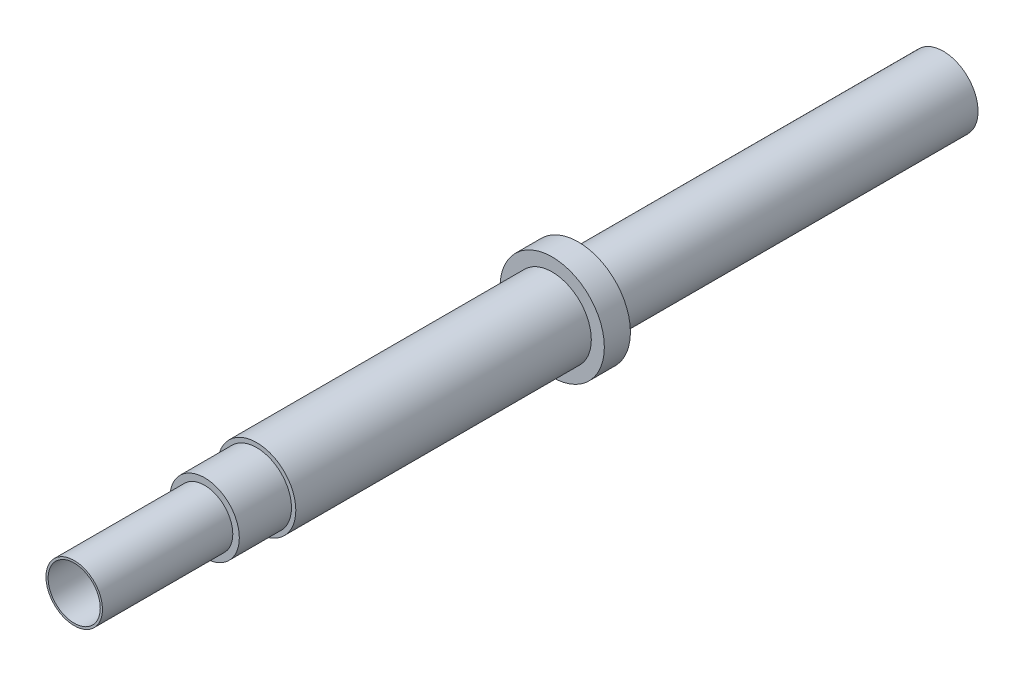
ISO-10303-21;
HEADER;
FILE_DESCRIPTION(('STEP AP214'),'2;1');
FILE_NAME('part.step','',(''),(''),'','','');
FILE_SCHEMA(('AUTOMOTIVE_DESIGN { 1 0 10303 214 1 1 1 1 }'));
ENDSEC;
DATA;
#1=APPLICATION_CONTEXT('core data for automotive mechanical design processes');
#2=APPLICATION_PROTOCOL_DEFINITION('international standard','automotive_design',2000,#1);
#3=PRODUCT_CONTEXT('',#1,'mechanical');
#4=PRODUCT('Part','Part','',(#3));
#5=PRODUCT_RELATED_PRODUCT_CATEGORY('part','',(#4));
#6=PRODUCT_DEFINITION_FORMATION('','',#4);
#7=PRODUCT_DEFINITION_CONTEXT('part definition',#1,'design');
#8=PRODUCT_DEFINITION('design','',#6,#7);
#9=PRODUCT_DEFINITION_SHAPE('','',#8);
#10=(LENGTH_UNIT() NAMED_UNIT(*) SI_UNIT(.MILLI.,.METRE.));
#11=(NAMED_UNIT(*) PLANE_ANGLE_UNIT() SI_UNIT($,.RADIAN.));
#12=(NAMED_UNIT(*) SI_UNIT($,.STERADIAN.) SOLID_ANGLE_UNIT());
#13=UNCERTAINTY_MEASURE_WITH_UNIT(LENGTH_MEASURE(1.E-05),#10,'distance_accuracy_value','');
#14=(GEOMETRIC_REPRESENTATION_CONTEXT(3) GLOBAL_UNCERTAINTY_ASSIGNED_CONTEXT((#13)) GLOBAL_UNIT_ASSIGNED_CONTEXT((#10,
#11,#12)) REPRESENTATION_CONTEXT('',''));
#15=CARTESIAN_POINT('',(0.,0.,0.));
#16=DIRECTION('',(0.,0.,1.));
#17=DIRECTION('',(1.,0.,0.));
#18=AXIS2_PLACEMENT_3D('',#15,#16,#17);
#19=CARTESIAN_POINT('',(0.,0.,85.));
#20=DIRECTION('',(0.,0.,1.));
#21=DIRECTION('',(1.,0.,0.));
#22=AXIS2_PLACEMENT_3D('',#19,#20,#21);
#23=PLANE('',#22);
#24=CARTESIAN_POINT('',(0.,0.,85.));
#25=DIRECTION('',(0.,0.,1.));
#26=DIRECTION('',(1.,0.,0.));
#27=AXIS2_PLACEMENT_3D('',#24,#25,#26);
#28=CIRCLE('',#27,4.);
#29=CARTESIAN_POINT('',(4.,0.,85.));
#30=VERTEX_POINT('',#29);
#31=EDGE_CURVE('E11',#30,#30,#28,.T.);
#32=ORIENTED_EDGE('',*,*,#31,.T.);
#33=EDGE_LOOP('',(#32));
#34=FACE_BOUND('',#33,.T.);
#35=CARTESIAN_POINT('',(0.,0.,85.));
#36=DIRECTION('',(0.,0.,1.));
#37=DIRECTION('',(1.,0.,0.));
#38=AXIS2_PLACEMENT_3D('',#35,#36,#37);
#39=CIRCLE('',#38,3.25);
#40=CARTESIAN_POINT('',(3.25,0.,85.));
#41=VERTEX_POINT('',#40);
#42=EDGE_CURVE('E62',#41,#41,#39,.T.);
#43=ORIENTED_EDGE('',*,*,#42,.F.);
#44=EDGE_LOOP('',(#43));
#45=FACE_BOUND('',#44,.T.);
#46=ADVANCED_FACE('F46',(#34,#45),#23,.T.);
#47=CARTESIAN_POINT('',(0.,0.,79.));
#48=DIRECTION('',(0.,0.,1.));
#49=DIRECTION('',(1.,0.,0.));
#50=AXIS2_PLACEMENT_3D('',#47,#48,#49);
#51=PLANE('',#50);
#52=CARTESIAN_POINT('',(0.,0.,79.));
#53=DIRECTION('',(0.,0.,1.));
#54=DIRECTION('',(1.,0.,0.));
#55=AXIS2_PLACEMENT_3D('',#52,#53,#54);
#56=CIRCLE('',#55,4.);
#57=CARTESIAN_POINT('',(4.,0.,79.));
#58=VERTEX_POINT('',#57);
#59=EDGE_CURVE('E50',#58,#58,#56,.T.);
#60=ORIENTED_EDGE('',*,*,#59,.F.);
#61=EDGE_LOOP('',(#60));
#62=FACE_BOUND('',#61,.T.);
#63=CARTESIAN_POINT('',(0.,0.,79.));
#64=DIRECTION('',(0.,0.,1.));
#65=DIRECTION('',(1.,0.,0.));
#66=AXIS2_PLACEMENT_3D('',#63,#64,#65);
#67=CIRCLE('',#66,3.);
#68=CARTESIAN_POINT('',(3.,0.,79.));
#69=VERTEX_POINT('',#68);
#70=EDGE_CURVE('E57',#69,#69,#67,.T.);
#71=ORIENTED_EDGE('',*,*,#70,.T.);
#72=EDGE_LOOP('',(#71));
#73=FACE_BOUND('',#72,.T.);
#74=ADVANCED_FACE('F87',(#62,#73),#51,.F.);
#75=CARTESIAN_POINT('',(0.,0.,85.));
#76=DIRECTION('',(0.,0.,-1.));
#77=DIRECTION('',(-1.,0.,0.));
#78=AXIS2_PLACEMENT_3D('',#75,#76,#77);
#79=CYLINDRICAL_SURFACE('',#78,4.);
#80=ORIENTED_EDGE('',*,*,#31,.F.);
#81=EDGE_LOOP('',(#80));
#82=FACE_BOUND('',#81,.T.);
#83=ORIENTED_EDGE('',*,*,#59,.T.);
#84=EDGE_LOOP('',(#83));
#85=FACE_BOUND('',#84,.T.);
#86=ADVANCED_FACE('F48',(#82,#85),#79,.T.);
#87=CARTESIAN_POINT('',(0.,0.,85.));
#88=DIRECTION('',(0.,0.,-1.));
#89=DIRECTION('',(-1.,0.,0.));
#90=AXIS2_PLACEMENT_3D('',#87,#88,#89);
#91=CYLINDRICAL_SURFACE('',#90,3.);
#92=ORIENTED_EDGE('',*,*,#70,.F.);
#93=EDGE_LOOP('',(#92));
#94=FACE_BOUND('',#93,.T.);
#95=CARTESIAN_POINT('',(0.,0.,100.));
#96=DIRECTION('',(0.,0.,1.));
#97=DIRECTION('',(1.,0.,0.));
#98=AXIS2_PLACEMENT_3D('',#95,#96,#97);
#99=CIRCLE('',#98,3.);
#100=CARTESIAN_POINT('',(3.,0.,100.));
#101=VERTEX_POINT('',#100);
#102=EDGE_CURVE('E65',#101,#101,#99,.T.);
#103=ORIENTED_EDGE('',*,*,#102,.T.);
#104=EDGE_LOOP('',(#103));
#105=FACE_BOUND('',#104,.T.);
#106=ADVANCED_FACE('F71',(#94,#105),#91,.F.);
#107=CARTESIAN_POINT('',(0.,0.,100.));
#108=DIRECTION('',(0.,0.,1.));
#109=DIRECTION('',(1.,0.,0.));
#110=AXIS2_PLACEMENT_3D('',#107,#108,#109);
#111=PLANE('',#110);
#112=CARTESIAN_POINT('',(0.,0.,100.));
#113=DIRECTION('',(0.,0.,1.));
#114=DIRECTION('',(1.,0.,0.));
#115=AXIS2_PLACEMENT_3D('',#112,#113,#114);
#116=CIRCLE('',#115,3.25);
#117=CARTESIAN_POINT('',(3.25,0.,100.));
#118=VERTEX_POINT('',#117);
#119=EDGE_CURVE('E61',#118,#118,#116,.T.);
#120=ORIENTED_EDGE('',*,*,#119,.T.);
#121=EDGE_LOOP('',(#120));
#122=FACE_BOUND('',#121,.T.);
#123=ORIENTED_EDGE('',*,*,#102,.F.);
#124=EDGE_LOOP('',(#123));
#125=FACE_BOUND('',#124,.T.);
#126=ADVANCED_FACE('F73',(#122,#125),#111,.T.);
#127=CARTESIAN_POINT('',(0.,0.,100.));
#128=DIRECTION('',(0.,0.,-1.));
#129=DIRECTION('',(-1.,0.,0.));
#130=AXIS2_PLACEMENT_3D('',#127,#128,#129);
#131=CYLINDRICAL_SURFACE('',#130,3.25);
#132=ORIENTED_EDGE('',*,*,#119,.F.);
#133=EDGE_LOOP('',(#132));
#134=FACE_BOUND('',#133,.T.);
#135=ORIENTED_EDGE('',*,*,#42,.T.);
#136=EDGE_LOOP('',(#135));
#137=FACE_BOUND('',#136,.T.);
#138=ADVANCED_FACE('F75',(#134,#137),#131,.T.);
#139=CLOSED_SHELL('',(#46,#74,#86,#106,#126,#138));
#140=MANIFOLD_SOLID_BREP('B2',#139);
#141=CARTESIAN_POINT('',(0.,0.,45.));
#142=DIRECTION('',(0.,0.,1.));
#143=DIRECTION('',(1.,0.,0.));
#144=AXIS2_PLACEMENT_3D('',#141,#142,#143);
#145=PLANE('',#144);
#146=CARTESIAN_POINT('',(0.,0.,45.));
#147=DIRECTION('',(0.,0.,1.));
#148=DIRECTION('',(1.,0.,0.));
#149=AXIS2_PLACEMENT_3D('',#146,#147,#148);
#150=CIRCLE('',#149,6.);
#151=CARTESIAN_POINT('',(6.,0.,45.));
#152=VERTEX_POINT('',#151);
#153=EDGE_CURVE('E45',#152,#152,#150,.T.);
#154=ORIENTED_EDGE('',*,*,#153,.T.);
#155=EDGE_LOOP('',(#154));
#156=FACE_BOUND('',#155,.T.);
#157=CARTESIAN_POINT('',(0.,0.,45.));
#158=DIRECTION('',(0.,0.,1.));
#159=DIRECTION('',(1.,0.,0.));
#160=AXIS2_PLACEMENT_3D('',#157,#158,#159);
#161=CIRCLE('',#160,4.5);
#162=CARTESIAN_POINT('',(4.5,0.,45.));
#163=VERTEX_POINT('',#162);
#164=EDGE_CURVE('E164',#163,#163,#161,.T.);
#165=ORIENTED_EDGE('',*,*,#164,.F.);
#166=EDGE_LOOP('',(#165));
#167=FACE_BOUND('',#166,.T.);
#168=ADVANCED_FACE('F148',(#156,#167),#145,.T.);
#169=CARTESIAN_POINT('',(0.,0.,42.));
#170=DIRECTION('',(0.,0.,1.));
#171=DIRECTION('',(1.,0.,0.));
#172=AXIS2_PLACEMENT_3D('',#169,#170,#171);
#173=PLANE('',#172);
#174=CARTESIAN_POINT('',(0.,0.,42.));
#175=DIRECTION('',(0.,0.,1.));
#176=DIRECTION('',(1.,0.,0.));
#177=AXIS2_PLACEMENT_3D('',#174,#175,#176);
#178=CIRCLE('',#177,6.);
#179=CARTESIAN_POINT('',(6.,0.,42.));
#180=VERTEX_POINT('',#179);
#181=EDGE_CURVE('E152',#180,#180,#178,.T.);
#182=ORIENTED_EDGE('',*,*,#181,.F.);
#183=EDGE_LOOP('',(#182));
#184=FACE_BOUND('',#183,.T.);
#185=CARTESIAN_POINT('',(0.,0.,42.));
#186=DIRECTION('',(0.,0.,1.));
#187=DIRECTION('',(1.,0.,0.));
#188=AXIS2_PLACEMENT_3D('',#185,#186,#187);
#189=CIRCLE('',#188,4.);
#190=CARTESIAN_POINT('',(4.,0.,42.));
#191=VERTEX_POINT('',#190);
#192=EDGE_CURVE('E159',#191,#191,#189,.T.);
#193=ORIENTED_EDGE('',*,*,#192,.T.);
#194=EDGE_LOOP('',(#193));
#195=FACE_BOUND('',#194,.T.);
#196=ADVANCED_FACE('F189',(#184,#195),#173,.F.);
#197=CARTESIAN_POINT('',(0.,0.,45.));
#198=DIRECTION('',(0.,0.,-1.));
#199=DIRECTION('',(-1.,0.,0.));
#200=AXIS2_PLACEMENT_3D('',#197,#198,#199);
#201=CYLINDRICAL_SURFACE('',#200,6.);
#202=ORIENTED_EDGE('',*,*,#153,.F.);
#203=EDGE_LOOP('',(#202));
#204=FACE_BOUND('',#203,.T.);
#205=ORIENTED_EDGE('',*,*,#181,.T.);
#206=EDGE_LOOP('',(#205));
#207=FACE_BOUND('',#206,.T.);
#208=ADVANCED_FACE('F150',(#204,#207),#201,.T.);
#209=CARTESIAN_POINT('',(0.,0.,45.));
#210=DIRECTION('',(0.,0.,-1.));
#211=DIRECTION('',(-1.,0.,0.));
#212=AXIS2_PLACEMENT_3D('',#209,#210,#211);
#213=CYLINDRICAL_SURFACE('',#212,4.);
#214=ORIENTED_EDGE('',*,*,#192,.F.);
#215=EDGE_LOOP('',(#214));
#216=FACE_BOUND('',#215,.T.);
#217=CARTESIAN_POINT('',(0.,0.,79.));
#218=DIRECTION('',(0.,0.,1.));
#219=DIRECTION('',(1.,0.,0.));
#220=AXIS2_PLACEMENT_3D('',#217,#218,#219);
#221=CIRCLE('',#220,4.);
#222=CARTESIAN_POINT('',(4.,0.,79.));
#223=VERTEX_POINT('',#222);
#224=EDGE_CURVE('E167',#223,#223,#221,.T.);
#225=ORIENTED_EDGE('',*,*,#224,.T.);
#226=EDGE_LOOP('',(#225));
#227=FACE_BOUND('',#226,.T.);
#228=ADVANCED_FACE('F173',(#216,#227),#213,.F.);
#229=CARTESIAN_POINT('',(0.,0.,79.));
#230=DIRECTION('',(0.,0.,1.));
#231=DIRECTION('',(1.,0.,0.));
#232=AXIS2_PLACEMENT_3D('',#229,#230,#231);
#233=PLANE('',#232);
#234=CARTESIAN_POINT('',(0.,0.,79.));
#235=DIRECTION('',(0.,0.,1.));
#236=DIRECTION('',(1.,0.,0.));
#237=AXIS2_PLACEMENT_3D('',#234,#235,#236);
#238=CIRCLE('',#237,4.5);
#239=CARTESIAN_POINT('',(4.5,0.,79.));
#240=VERTEX_POINT('',#239);
#241=EDGE_CURVE('E163',#240,#240,#238,.T.);
#242=ORIENTED_EDGE('',*,*,#241,.T.);
#243=EDGE_LOOP('',(#242));
#244=FACE_BOUND('',#243,.T.);
#245=ORIENTED_EDGE('',*,*,#224,.F.);
#246=EDGE_LOOP('',(#245));
#247=FACE_BOUND('',#246,.T.);
#248=ADVANCED_FACE('F175',(#244,#247),#233,.T.);
#249=CARTESIAN_POINT('',(0.,0.,79.));
#250=DIRECTION('',(0.,0.,-1.));
#251=DIRECTION('',(-1.,0.,0.));
#252=AXIS2_PLACEMENT_3D('',#249,#250,#251);
#253=CYLINDRICAL_SURFACE('',#252,4.5);
#254=ORIENTED_EDGE('',*,*,#241,.F.);
#255=EDGE_LOOP('',(#254));
#256=FACE_BOUND('',#255,.T.);
#257=ORIENTED_EDGE('',*,*,#164,.T.);
#258=EDGE_LOOP('',(#257));
#259=FACE_BOUND('',#258,.T.);
#260=ADVANCED_FACE('F177',(#256,#259),#253,.T.);
#261=CLOSED_SHELL('',(#168,#196,#208,#228,#248,#260));
#262=MANIFOLD_SOLID_BREP('B6',#261);
#263=CARTESIAN_POINT('',(0.,0.,42.));
#264=DIRECTION('',(0.,0.,1.));
#265=DIRECTION('',(1.,0.,0.));
#266=AXIS2_PLACEMENT_3D('',#263,#264,#265);
#267=PLANE('',#266);
#268=CARTESIAN_POINT('',(0.,0.,42.));
#269=DIRECTION('',(0.,0.,1.));
#270=DIRECTION('',(1.,0.,0.));
#271=AXIS2_PLACEMENT_3D('',#268,#269,#270);
#272=CIRCLE('',#271,4.);
#273=CARTESIAN_POINT('',(-4.,0.,42.));
#274=VERTEX_POINT('',#273);
#275=EDGE_CURVE('E147',#274,#274,#272,.T.);
#276=ORIENTED_EDGE('',*,*,#275,.T.);
#277=EDGE_LOOP('',(#276));
#278=FACE_BOUND('',#277,.T.);
#279=CARTESIAN_POINT('',(0.,0.,42.));
#280=DIRECTION('',(0.,0.,1.));
#281=DIRECTION('',(1.,0.,0.));
#282=AXIS2_PLACEMENT_3D('',#279,#280,#281);
#283=CIRCLE('',#282,3.);
#284=CARTESIAN_POINT('',(-3.,0.,42.));
#285=VERTEX_POINT('',#284);
#286=EDGE_CURVE('E254',#285,#285,#283,.T.);
#287=ORIENTED_EDGE('',*,*,#286,.F.);
#288=EDGE_LOOP('',(#287));
#289=FACE_BOUND('',#288,.T.);
#290=ADVANCED_FACE('F243',(#278,#289),#267,.T.);
#291=CARTESIAN_POINT('',(0.,0.,0.));
#292=DIRECTION('',(0.,0.,1.));
#293=DIRECTION('',(1.,0.,0.));
#294=AXIS2_PLACEMENT_3D('',#291,#292,#293);
#295=PLANE('',#294);
#296=CARTESIAN_POINT('',(0.,0.,0.));
#297=DIRECTION('',(0.,0.,1.));
#298=DIRECTION('',(1.,0.,0.));
#299=AXIS2_PLACEMENT_3D('',#296,#297,#298);
#300=CIRCLE('',#299,4.);
#301=CARTESIAN_POINT('',(-4.,0.,0.));
#302=VERTEX_POINT('',#301);
#303=EDGE_CURVE('E247',#302,#302,#300,.T.);
#304=ORIENTED_EDGE('',*,*,#303,.F.);
#305=EDGE_LOOP('',(#304));
#306=FACE_BOUND('',#305,.T.);
#307=CARTESIAN_POINT('',(0.,0.,0.));
#308=DIRECTION('',(0.,0.,1.));
#309=DIRECTION('',(1.,0.,0.));
#310=AXIS2_PLACEMENT_3D('',#307,#308,#309);
#311=CIRCLE('',#310,3.);
#312=CARTESIAN_POINT('',(-3.,0.,0.));
#313=VERTEX_POINT('',#312);
#314=EDGE_CURVE('E256',#313,#313,#311,.T.);
#315=ORIENTED_EDGE('',*,*,#314,.T.);
#316=EDGE_LOOP('',(#315));
#317=FACE_BOUND('',#316,.T.);
#318=ADVANCED_FACE('F266',(#306,#317),#295,.F.);
#319=CARTESIAN_POINT('',(0.,0.,42.));
#320=DIRECTION('',(0.,0.,-1.));
#321=DIRECTION('',(-1.,0.,0.));
#322=AXIS2_PLACEMENT_3D('',#319,#320,#321);
#323=CYLINDRICAL_SURFACE('',#322,4.);
#324=CARTESIAN_POINT('',(-4.,0.,42.));
#325=CARTESIAN_POINT('',(-4.,0.,41.5625));
#326=CARTESIAN_POINT('',(-4.,0.,41.125));
#327=CARTESIAN_POINT('',(-4.,0.,40.25));
#328=CARTESIAN_POINT('',(-4.,0.,39.8125));
#329=CARTESIAN_POINT('',(-4.,0.,38.9375));
#330=CARTESIAN_POINT('',(-4.,0.,38.5));
#331=CARTESIAN_POINT('',(-4.,0.,37.625));
#332=CARTESIAN_POINT('',(-4.,0.,37.1875));
#333=CARTESIAN_POINT('',(-4.,0.,36.3125));
#334=CARTESIAN_POINT('',(-4.,0.,35.875));
#335=CARTESIAN_POINT('',(-4.,0.,35.));
#336=CARTESIAN_POINT('',(-4.,0.,34.5625));
#337=CARTESIAN_POINT('',(-4.,0.,33.6875));
#338=CARTESIAN_POINT('',(-4.,0.,33.25));
#339=CARTESIAN_POINT('',(-4.,0.,32.375));
#340=CARTESIAN_POINT('',(-4.,0.,31.9375));
#341=CARTESIAN_POINT('',(-4.,0.,31.0625));
#342=CARTESIAN_POINT('',(-4.,0.,30.625));
#343=CARTESIAN_POINT('',(-4.,0.,29.75));
#344=CARTESIAN_POINT('',(-4.,0.,29.3125));
#345=CARTESIAN_POINT('',(-4.,0.,28.4375));
#346=CARTESIAN_POINT('',(-4.,0.,28.));
#347=CARTESIAN_POINT('',(-4.,0.,27.125));
#348=CARTESIAN_POINT('',(-4.,0.,26.6875));
#349=CARTESIAN_POINT('',(-4.,0.,25.8125));
#350=CARTESIAN_POINT('',(-4.,0.,25.375));
#351=CARTESIAN_POINT('',(-4.,0.,24.5));
#352=CARTESIAN_POINT('',(-4.,0.,24.0625));
#353=CARTESIAN_POINT('',(-4.,0.,23.1875));
#354=CARTESIAN_POINT('',(-4.,0.,22.75));
#355=CARTESIAN_POINT('',(-4.,0.,21.875));
#356=CARTESIAN_POINT('',(-4.,0.,21.4375));
#357=CARTESIAN_POINT('',(-4.,0.,20.5625));
#358=CARTESIAN_POINT('',(-4.,0.,20.125));
#359=CARTESIAN_POINT('',(-4.,0.,19.25));
#360=CARTESIAN_POINT('',(-4.,0.,18.8125));
#361=CARTESIAN_POINT('',(-4.,0.,17.9375));
#362=CARTESIAN_POINT('',(-4.,0.,17.5));
#363=CARTESIAN_POINT('',(-4.,0.,16.625));
#364=CARTESIAN_POINT('',(-4.,0.,16.1875));
#365=CARTESIAN_POINT('',(-4.,0.,15.3125));
#366=CARTESIAN_POINT('',(-4.,0.,14.875));
#367=CARTESIAN_POINT('',(-4.,0.,14.));
#368=CARTESIAN_POINT('',(-4.,0.,13.5625));
#369=CARTESIAN_POINT('',(-4.,0.,12.6875));
#370=CARTESIAN_POINT('',(-4.,0.,12.25));
#371=CARTESIAN_POINT('',(-4.,0.,11.375));
#372=CARTESIAN_POINT('',(-4.,0.,10.9375));
#373=CARTESIAN_POINT('',(-4.,0.,10.0625));
#374=CARTESIAN_POINT('',(-4.,0.,9.625));
#375=CARTESIAN_POINT('',(-4.,0.,8.75));
#376=CARTESIAN_POINT('',(-4.,0.,8.3125));
#377=CARTESIAN_POINT('',(-4.,0.,7.4375));
#378=CARTESIAN_POINT('',(-4.,0.,7.));
#379=CARTESIAN_POINT('',(-4.,0.,6.125));
#380=CARTESIAN_POINT('',(-4.,0.,5.6875));
#381=CARTESIAN_POINT('',(-4.,0.,4.8125));
#382=CARTESIAN_POINT('',(-4.,0.,4.375));
#383=CARTESIAN_POINT('',(-4.,0.,3.5));
#384=CARTESIAN_POINT('',(-4.,0.,3.0625));
#385=CARTESIAN_POINT('',(-4.,0.,2.1875));
#386=CARTESIAN_POINT('',(-4.,0.,1.75));
#387=CARTESIAN_POINT('',(-4.,0.,0.875000000000001));
#388=CARTESIAN_POINT('',(-4.,0.,0.4375));
#389=CARTESIAN_POINT('',(-4.,0.,0.));
#390=B_SPLINE_CURVE_WITH_KNOTS('',3,(#324,#325,#326,#327,#328,#329,#330,#331,#332,#333,#334,
#335,#336,#337,#338,#339,#340,#341,#342,#343,#344,#345,#346,#347,#348,#349,#350,#351,#352,#353,
#354,#355,#356,#357,#358,#359,#360,#361,#362,#363,#364,#365,#366,#367,#368,#369,#370,#371,#372,
#373,#374,#375,#376,#377,#378,#379,#380,#381,#382,#383,#384,#385,#386,#387,#388,#389),
.UNSPECIFIED.,.F.,.F.,(4,2,2,2,2,2,2,2,2,2,2,2,2,2,2,2,2,2,2,2,2,2,2,2,2,2,2,2,2,2,2,2,4),(0.,
1.3125,2.625,3.9375,5.25,6.56250000000001,7.875,9.1875,10.5,11.8125,13.125,14.4375,15.75,
17.0625,18.375,19.6875,21.,22.3125,23.625,24.9375,26.25,27.5625,28.875,30.1875,31.5,32.8125,
34.125,35.4375,36.75,38.0625,39.375,40.6875,42.),.UNSPECIFIED.);
#391=EDGE_CURVE('BSEAM245',#274,#302,#390,.T.);
#392=ORIENTED_EDGE('',*,*,#275,.F.);
#393=ORIENTED_EDGE('',*,*,#303,.T.);
#394=ORIENTED_EDGE('',*,*,#391,.T.);
#395=ORIENTED_EDGE('',*,*,#391,.F.);
#396=EDGE_LOOP('',(#392,#394,#393,#395));
#397=FACE_BOUND('',#396,.T.);
#398=ADVANCED_FACE('F245',(#397),#323,.T.);
#399=CARTESIAN_POINT('',(0.,0.,42.));
#400=DIRECTION('',(0.,0.,-1.));
#401=DIRECTION('',(-1.,0.,0.));
#402=AXIS2_PLACEMENT_3D('',#399,#400,#401);
#403=CYLINDRICAL_SURFACE('',#402,3.);
#404=CARTESIAN_POINT('',(-3.,0.,42.));
#405=CARTESIAN_POINT('',(-3.,0.,41.5625));
#406=CARTESIAN_POINT('',(-3.,0.,41.125));
#407=CARTESIAN_POINT('',(-3.,0.,40.25));
#408=CARTESIAN_POINT('',(-3.,0.,39.8125));
#409=CARTESIAN_POINT('',(-3.,0.,38.9375));
#410=CARTESIAN_POINT('',(-3.,0.,38.5));
#411=CARTESIAN_POINT('',(-3.,0.,37.625));
#412=CARTESIAN_POINT('',(-3.,0.,37.1875));
#413=CARTESIAN_POINT('',(-3.,0.,36.3125));
#414=CARTESIAN_POINT('',(-3.,0.,35.875));
#415=CARTESIAN_POINT('',(-3.,0.,35.));
#416=CARTESIAN_POINT('',(-3.,0.,34.5625));
#417=CARTESIAN_POINT('',(-3.,0.,33.6875));
#418=CARTESIAN_POINT('',(-3.,0.,33.25));
#419=CARTESIAN_POINT('',(-3.,0.,32.375));
#420=CARTESIAN_POINT('',(-3.,0.,31.9375));
#421=CARTESIAN_POINT('',(-3.,0.,31.0625));
#422=CARTESIAN_POINT('',(-3.,0.,30.625));
#423=CARTESIAN_POINT('',(-3.,0.,29.75));
#424=CARTESIAN_POINT('',(-3.,0.,29.3125));
#425=CARTESIAN_POINT('',(-3.,0.,28.4375));
#426=CARTESIAN_POINT('',(-3.,0.,28.));
#427=CARTESIAN_POINT('',(-3.,0.,27.125));
#428=CARTESIAN_POINT('',(-3.,0.,26.6875));
#429=CARTESIAN_POINT('',(-3.,0.,25.8125));
#430=CARTESIAN_POINT('',(-3.,0.,25.375));
#431=CARTESIAN_POINT('',(-3.,0.,24.5));
#432=CARTESIAN_POINT('',(-3.,0.,24.0625));
#433=CARTESIAN_POINT('',(-3.,0.,23.1875));
#434=CARTESIAN_POINT('',(-3.,0.,22.75));
#435=CARTESIAN_POINT('',(-3.,0.,21.875));
#436=CARTESIAN_POINT('',(-3.,0.,21.4375));
#437=CARTESIAN_POINT('',(-3.,0.,20.5625));
#438=CARTESIAN_POINT('',(-3.,0.,20.125));
#439=CARTESIAN_POINT('',(-3.,0.,19.25));
#440=CARTESIAN_POINT('',(-3.,0.,18.8125));
#441=CARTESIAN_POINT('',(-3.,0.,17.9375));
#442=CARTESIAN_POINT('',(-3.,0.,17.5));
#443=CARTESIAN_POINT('',(-3.,0.,16.625));
#444=CARTESIAN_POINT('',(-3.,0.,16.1875));
#445=CARTESIAN_POINT('',(-3.,0.,15.3125));
#446=CARTESIAN_POINT('',(-3.,0.,14.875));
#447=CARTESIAN_POINT('',(-3.,0.,14.));
#448=CARTESIAN_POINT('',(-3.,0.,13.5625));
#449=CARTESIAN_POINT('',(-3.,0.,12.6875));
#450=CARTESIAN_POINT('',(-3.,0.,12.25));
#451=CARTESIAN_POINT('',(-3.,0.,11.375));
#452=CARTESIAN_POINT('',(-3.,0.,10.9375));
#453=CARTESIAN_POINT('',(-3.,0.,10.0625));
#454=CARTESIAN_POINT('',(-3.,0.,9.625));
#455=CARTESIAN_POINT('',(-3.,0.,8.75));
#456=CARTESIAN_POINT('',(-3.,0.,8.3125));
#457=CARTESIAN_POINT('',(-3.,0.,7.4375));
#458=CARTESIAN_POINT('',(-3.,0.,7.));
#459=CARTESIAN_POINT('',(-3.,0.,6.125));
#460=CARTESIAN_POINT('',(-3.,0.,5.6875));
#461=CARTESIAN_POINT('',(-3.,0.,4.8125));
#462=CARTESIAN_POINT('',(-3.,0.,4.375));
#463=CARTESIAN_POINT('',(-3.,0.,3.5));
#464=CARTESIAN_POINT('',(-3.,0.,3.0625));
#465=CARTESIAN_POINT('',(-3.,0.,2.1875));
#466=CARTESIAN_POINT('',(-3.,0.,1.75));
#467=CARTESIAN_POINT('',(-3.,0.,0.875000000000001));
#468=CARTESIAN_POINT('',(-3.,0.,0.4375));
#469=CARTESIAN_POINT('',(-3.,0.,0.));
#470=B_SPLINE_CURVE_WITH_KNOTS('',3,(#404,#405,#406,#407,#408,#409,#410,#411,#412,#413,#414,
#415,#416,#417,#418,#419,#420,#421,#422,#423,#424,#425,#426,#427,#428,#429,#430,#431,#432,#433,
#434,#435,#436,#437,#438,#439,#440,#441,#442,#443,#444,#445,#446,#447,#448,#449,#450,#451,#452,
#453,#454,#455,#456,#457,#458,#459,#460,#461,#462,#463,#464,#465,#466,#467,#468,#469),
.UNSPECIFIED.,.F.,.F.,(4,2,2,2,2,2,2,2,2,2,2,2,2,2,2,2,2,2,2,2,2,2,2,2,2,2,2,2,2,2,2,2,4),(0.,
1.31249999999999,2.625,3.9375,5.25,6.5625,7.87499999999999,9.18749999999999,10.5,11.8125,13.125,
14.4375,15.75,17.0625,18.375,19.6875,21.,22.3125,23.625,24.9375,26.25,27.5625,28.875,30.1875,
31.5,32.8125,34.125,35.4375,36.75,38.0625,39.375,40.6875,42.),.UNSPECIFIED.);
#471=EDGE_CURVE('BSEAM262',#285,#313,#470,.T.);
#472=ORIENTED_EDGE('',*,*,#286,.T.);
#473=ORIENTED_EDGE('',*,*,#314,.F.);
#474=ORIENTED_EDGE('',*,*,#471,.T.);
#475=ORIENTED_EDGE('',*,*,#471,.F.);
#476=EDGE_LOOP('',(#472,#474,#473,#475));
#477=FACE_BOUND('',#476,.T.);
#478=ADVANCED_FACE('F262',(#477),#403,.F.);
#479=CLOSED_SHELL('',(#290,#318,#398,#478));
#480=MANIFOLD_SOLID_BREP('B40',#479);
#481=ADVANCED_BREP_SHAPE_REPRESENTATION('',(#18,#140,#262,#480),#14);
#482=SHAPE_DEFINITION_REPRESENTATION(#9,#481);
ENDSEC;
END-ISO-10303-21;
